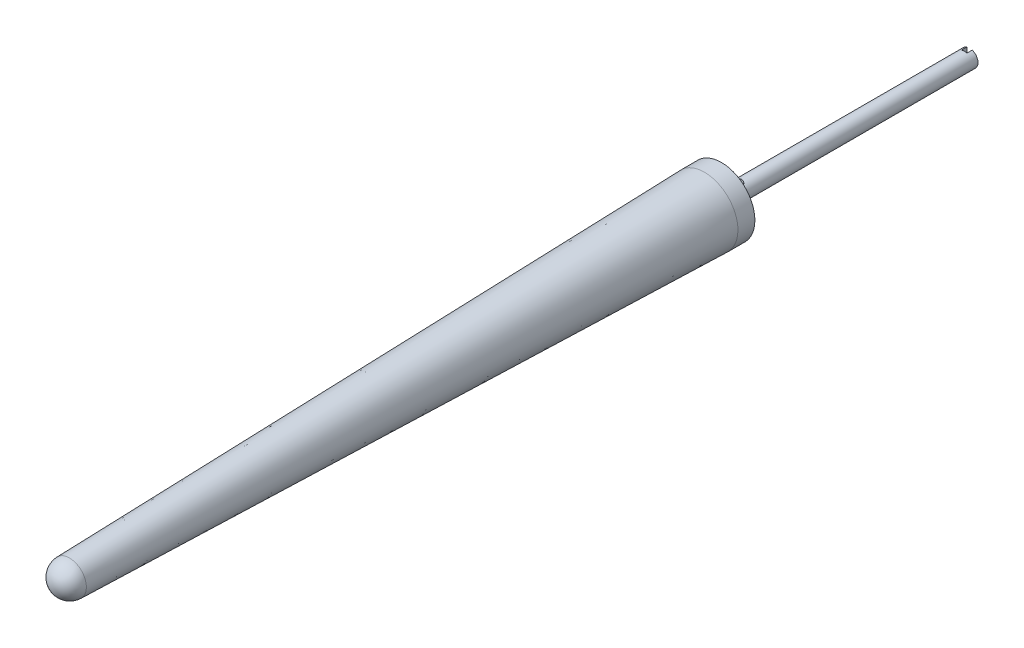
ISO-10303-21;
HEADER;
FILE_DESCRIPTION(('STEP AP214'),'2;1');
FILE_NAME('part.step','',(''),(''),'','','');
FILE_SCHEMA(('AUTOMOTIVE_DESIGN { 1 0 10303 214 1 1 1 1 }'));
ENDSEC;
DATA;
#1=APPLICATION_CONTEXT('core data for automotive mechanical design processes');
#2=APPLICATION_PROTOCOL_DEFINITION('international standard','automotive_design',2000,#1);
#3=PRODUCT_CONTEXT('',#1,'mechanical');
#4=PRODUCT('Part','Part','',(#3));
#5=PRODUCT_RELATED_PRODUCT_CATEGORY('part','',(#4));
#6=PRODUCT_DEFINITION_FORMATION('','',#4);
#7=PRODUCT_DEFINITION_CONTEXT('part definition',#1,'design');
#8=PRODUCT_DEFINITION('design','',#6,#7);
#9=PRODUCT_DEFINITION_SHAPE('','',#8);
#10=(LENGTH_UNIT() NAMED_UNIT(*) SI_UNIT(.MILLI.,.METRE.));
#11=(NAMED_UNIT(*) PLANE_ANGLE_UNIT() SI_UNIT($,.RADIAN.));
#12=(NAMED_UNIT(*) SI_UNIT($,.STERADIAN.) SOLID_ANGLE_UNIT());
#13=UNCERTAINTY_MEASURE_WITH_UNIT(LENGTH_MEASURE(1.E-05),#10,'distance_accuracy_value','');
#14=(GEOMETRIC_REPRESENTATION_CONTEXT(3) GLOBAL_UNCERTAINTY_ASSIGNED_CONTEXT((#13)) GLOBAL_UNIT_ASSIGNED_CONTEXT((#10,
#11,#12)) REPRESENTATION_CONTEXT('',''));
#15=CARTESIAN_POINT('',(0.,0.,0.));
#16=DIRECTION('',(0.,0.,1.));
#17=DIRECTION('',(1.,0.,0.));
#18=AXIS2_PLACEMENT_3D('',#15,#16,#17);
#19=CARTESIAN_POINT('',(0.,0.,0.));
#20=DIRECTION('',(0.,0.,-1.));
#21=DIRECTION('',(0.,1.,0.));
#22=AXIS2_PLACEMENT_3D('',#19,#20,#21);
#23=PLANE('',#22);
#24=CARTESIAN_POINT('',(0.,0.,0.));
#25=DIRECTION('',(0.,0.,-1.));
#26=DIRECTION('',(0.,1.,0.));
#27=AXIS2_PLACEMENT_3D('',#24,#25,#26);
#28=CIRCLE('',#27,2.555);
#29=CARTESIAN_POINT('',(0.81,2.42320552161801,0.));
#30=VERTEX_POINT('',#29);
#31=CARTESIAN_POINT('',(0.81,-2.42320552161801,0.));
#32=VERTEX_POINT('',#31);
#33=EDGE_CURVE('E50',#30,#32,#28,.T.);
#34=ORIENTED_EDGE('',*,*,#33,.T.);
#35=DIRECTION('',(0.,1.,0.));
#36=VECTOR('',#35,1.);
#37=CARTESIAN_POINT('',(0.81,0.,0.));
#38=LINE('',#37,#36);
#39=EDGE_CURVE('E86',#32,#30,#38,.T.);
#40=ORIENTED_EDGE('',*,*,#39,.T.);
#41=EDGE_LOOP('',(#34,#40));
#42=FACE_BOUND('',#41,.T.);
#43=ADVANCED_FACE('F38',(#42),#23,.T.);
#44=CARTESIAN_POINT('',(-0.810000000000001,-2.42320552161801,0.));
#45=VERTEX_POINT('',#44);
#46=CARTESIAN_POINT('',(-0.810000000000001,2.42320552161801,0.));
#47=VERTEX_POINT('',#46);
#48=EDGE_CURVE('E133',#45,#47,#28,.T.);
#49=ORIENTED_EDGE('',*,*,#48,.T.);
#50=DIRECTION('',(0.,-1.,0.));
#51=VECTOR('',#50,1.);
#52=CARTESIAN_POINT('',(-0.810000000000001,0.,0.));
#53=LINE('',#52,#51);
#54=EDGE_CURVE('E100',#47,#45,#53,.T.);
#55=ORIENTED_EDGE('',*,*,#54,.T.);
#56=EDGE_LOOP('',(#49,#55));
#57=FACE_BOUND('',#56,.T.);
#58=ADVANCED_FACE('F163',(#57),#23,.T.);
#59=CARTESIAN_POINT('',(0.,0.,0.));
#60=DIRECTION('',(0.,0.,-1.));
#61=DIRECTION('',(0.,1.,0.));
#62=AXIS2_PLACEMENT_3D('',#59,#60,#61);
#63=CYLINDRICAL_SURFACE('',#62,2.555);
#64=CARTESIAN_POINT('',(0.,2.55499999999999,71.675));
#65=CARTESIAN_POINT('',(0.0770059698897007,2.5549939567661,71.6749931497951));
#66=CARTESIAN_POINT('',(0.154128706922779,2.55148033661649,71.6690289649739));
#67=CARTESIAN_POINT('',(0.306087176172844,2.53775354535387,71.6454611228513));
#68=CARTESIAN_POINT('',(0.380916089762932,2.52752210987463,71.6278257328872));
#69=CARTESIAN_POINT('',(0.525736054215615,2.50140242897395,71.5818913920997));
#70=CARTESIAN_POINT('',(0.59574902732163,2.48554216631569,71.5536451514195));
#71=CARTESIAN_POINT('',(0.729832545082676,2.4495296153609,71.4876061357694));
#72=CARTESIAN_POINT('',(0.793904986450894,2.42937870381841,71.4498164223217));
#73=CARTESIAN_POINT('',(0.919703734141278,2.38473264175775,71.3626164567013));
#74=CARTESIAN_POINT('',(0.980898208715174,2.36002552747576,71.3125494992406));
#75=CARTESIAN_POINT('',(1.09454116088226,2.30951957330275,71.2036802769454));
#76=CARTESIAN_POINT('',(1.14697854468765,2.28371939976013,71.1448671076687));
#77=CARTESIAN_POINT('',(1.24778847161014,2.2303950240156,71.0121125106492));
#78=CARTESIAN_POINT('',(1.29498050412057,2.2030188926985,70.9372072876753));
#79=CARTESIAN_POINT('',(1.37591564682643,2.15340323029841,70.7789236861718));
#80=CARTESIAN_POINT('',(1.40968000703981,2.13115560672199,70.6955589598539));
#81=CARTESIAN_POINT('',(1.45593907800053,2.0997283946479,70.5425108436391));
#82=CARTESIAN_POINT('',(1.47155274903126,2.08871362883254,70.4741481685176));
#83=CARTESIAN_POINT('',(1.49307108752029,2.07338986464256,70.3352052206688));
#84=CARTESIAN_POINT('',(1.49898704190472,2.06907307098169,70.2646276235206));
#85=CARTESIAN_POINT('',(1.50077498550909,2.06777691194061,70.1231585473327));
#86=CARTESIAN_POINT('',(1.49663016612963,2.07080982574998,70.0522667407993));
#87=CARTESIAN_POINT('',(1.47851761161012,2.08377748127177,69.9123818474535));
#88=CARTESIAN_POINT('',(1.4645427675151,2.09371721785169,69.8433901723386));
#89=CARTESIAN_POINT('',(1.42764937567467,2.11904016541578,69.7095998791518));
#90=CARTESIAN_POINT('',(1.40480823633467,2.13437615811386,69.6447704807733));
#91=CARTESIAN_POINT('',(1.35099818509553,2.16883554611701,69.5196786042477));
#92=CARTESIAN_POINT('',(1.32002623331173,2.18796035729841,69.4594178450706));
#93=CARTESIAN_POINT('',(1.24481801410408,2.2317362640171,69.334400181644));
#94=CARTESIAN_POINT('',(1.19922658505693,2.25677570756092,69.2705937582982));
#95=CARTESIAN_POINT('',(1.09878456388406,2.30735014242893,69.1508978101071));
#96=CARTESIAN_POINT('',(1.04392553387584,2.33288556640776,69.095015586075));
#97=CARTESIAN_POINT('',(0.918169125790957,2.38541385955836,68.9855609541257));
#98=CARTESIAN_POINT('',(0.846118945745785,2.41217814329383,68.9331891873124));
#99=CARTESIAN_POINT('',(0.69260259744821,2.46064814442818,68.841478595311));
#100=CARTESIAN_POINT('',(0.611141982952746,2.48235682290701,68.8021321354486));
#101=CARTESIAN_POINT('',(0.446595986595554,2.51697554073947,68.7405155068271));
#102=CARTESIAN_POINT('',(0.363976362745708,2.530373486345,68.7172861726704));
#103=CARTESIAN_POINT('',(0.195115659548756,2.5489489262743,68.6852715199472));
#104=CARTESIAN_POINT('',(0.108878665284251,2.55413545013892,68.6764703353496));
#105=CARTESIAN_POINT('',(-0.052682390869906,2.5555671869151,68.674035889805));
#106=CARTESIAN_POINT('',(-0.127976854594546,2.55288105775809,68.6785898187282));
#107=CARTESIAN_POINT('',(-0.276532702127037,2.54108321566118,68.6988066055047));
#108=CARTESIAN_POINT('',(-0.349794089038197,2.5319715125299,68.7144694464002));
#109=CARTESIAN_POINT('',(-0.491055956611559,2.50837297064611,68.7557783630785));
#110=CARTESIAN_POINT('',(-0.559126323277488,2.49398353018161,68.7812439312919));
#111=CARTESIAN_POINT('',(-0.690041742585759,2.46098157020235,68.8411968768074));
#112=CARTESIAN_POINT('',(-0.752885663175146,2.44236813900597,68.8756862019909));
#113=CARTESIAN_POINT('',(-0.878636575110542,2.40018059328197,68.9567374848173));
#114=CARTESIAN_POINT('',(-0.940866965178772,2.37629160415719,69.0041832514027));
#115=CARTESIAN_POINT('',(-1.05696263058124,2.32698139764641,69.1078093926084));
#116=CARTESIAN_POINT('',(-1.11081801100005,2.30155841634459,69.1639999446137));
#117=CARTESIAN_POINT('',(-1.21536725077065,2.24827745419766,69.2915469283686));
#118=CARTESIAN_POINT('',(-1.26487398247557,2.22050076175489,69.3639172428554));
#119=CARTESIAN_POINT('',(-1.35098717853863,2.16918833625056,69.517317821603));
#120=CARTESIAN_POINT('',(-1.38760908759435,2.14564754238795,69.5983375650599));
#121=CARTESIAN_POINT('',(-1.43996225426285,2.11075887826738,69.7490591550851));
#122=CARTESIAN_POINT('',(-1.4584965205662,2.09787595138669,69.8174290625986));
#123=CARTESIAN_POINT('',(-1.48576410933503,2.07865721899144,69.9569587623675));
#124=CARTESIAN_POINT('',(-1.49450994722198,2.07231305388164,70.0281148713768));
#125=CARTESIAN_POINT('',(-1.50171539468282,2.06709918943243,70.1714400080412));
#126=CARTESIAN_POINT('',(-1.50014507474609,2.0682512382153,70.2436113762406));
#127=CARTESIAN_POINT('',(-1.48674831163694,2.07789973491922,70.3865098565017));
#128=CARTESIAN_POINT('',(-1.47491572815937,2.0864005798965,70.4572360779393));
#129=CARTESIAN_POINT('',(-1.44222233395535,2.10912162607089,70.5929857758003));
#130=CARTESIAN_POINT('',(-1.4216763661425,2.12314125342741,70.6581208345357));
#131=CARTESIAN_POINT('',(-1.3724251905008,2.15530431656303,70.7841229548011));
#132=CARTESIAN_POINT('',(-1.34371690995769,2.17344930482376,70.8449883982501));
#133=CARTESIAN_POINT('',(-1.2738350700616,2.21523552599267,70.970797686459));
#134=CARTESIAN_POINT('',(-1.231419442007,2.23929275533318,71.0349127711018));
#135=CARTESIAN_POINT('',(-1.13754366002254,2.28841238422208,71.1557430448492));
#136=CARTESIAN_POINT('',(-1.08607630686972,2.31347557151368,71.2124522807358));
#137=CARTESIAN_POINT('',(-0.966710576857526,2.36608012336212,71.3252834805806));
#138=CARTESIAN_POINT('',(-0.897511339270102,2.39345237742522,71.3801226738291));
#139=CARTESIAN_POINT('',(-0.749406533989161,2.44387762305054,71.477398316977));
#140=CARTESIAN_POINT('',(-0.670498465984121,2.46692949811429,71.5198315624384));
#141=CARTESIAN_POINT('',(-0.508422824731335,2.50521910420868,71.588820816449));
#142=CARTESIAN_POINT('',(-0.425595134986147,2.52075587379087,71.6159929465936));
#143=CARTESIAN_POINT('',(-0.298202353475473,2.53790263282681,71.6457084580572));
#144=CARTESIAN_POINT('',(-0.255262777641471,2.54259000184083,71.6537703058155));
#145=CARTESIAN_POINT('',(-0.168674216795624,2.54979425707585,71.6661248836621));
#146=CARTESIAN_POINT('',(-0.125025821629426,2.55231286232562,71.6704205989518));
#147=CARTESIAN_POINT('',(-0.0542074134874949,2.55456949710886,71.674266422091));
#148=CARTESIAN_POINT('',(-0.0271109432864072,2.5550021275983,71.6750024117028));
#149=CARTESIAN_POINT('',(0.,2.55499999999999,71.675));
#150=B_SPLINE_CURVE_WITH_KNOTS('',3,(#64,#65,#66,#67,#68,#69,#70,#71,#72,#73,#74,#75,#76,#77,
#78,#79,#80,#81,#82,#83,#84,#85,#86,#87,#88,#89,#90,#91,#92,#93,#94,#95,#96,#97,#98,#99,#100,
#101,#102,#103,#104,#105,#106,#107,#108,#109,#110,#111,#112,#113,#114,#115,#116,#117,#118,#119,
#120,#121,#122,#123,#124,#125,#126,#127,#128,#129,#130,#131,#132,#133,#134,#135,#136,#137,#138,
#139,#140,#141,#142,#143,#144,#145,#146,#147,#148,#149),.UNSPECIFIED.,.T.,.F.,(4,2,2,2,2,2,2,2,
2,2,2,2,2,2,2,2,2,2,2,2,2,2,2,2,2,2,2,2,2,2,2,2,2,2,2,2,2,2,2,2,2,2,4),(0.,0.23092052914322,
0.462471498251258,0.692887113980689,0.923228906641973,1.17075877573799,1.41859988386794,
1.69524231700337,1.97144518951478,2.18348333063536,2.39527451027492,2.60741977427472,
2.81971861710888,3.03020419735185,3.24076858465199,3.48677499583314,3.7330066079395,
4.01059859695246,4.28802758846418,4.54706392358518,4.80581521576945,5.03113525099953,
5.25645494227992,5.47781005688637,5.69921299301163,5.94370032182232,6.18847434841535,
6.46310838271006,6.7374120897928,6.95250620310438,7.16732498316266,7.38276727584325,
7.59833856489739,7.80670757373467,8.01515512747786,8.2558925955435,8.49682240547028,
8.77276199330388,9.04877279308351,9.31264652838948,9.44428859050131,9.57582621277052,
9.65712475856166),.UNSPECIFIED.);
#151=CARTESIAN_POINT('',(0.,2.55499999999999,71.675));
#152=VERTEX_POINT('',#151);
#153=EDGE_CURVE('E11',#152,#152,#150,.T.);
#154=ORIENTED_EDGE('',*,*,#153,.F.);
#155=EDGE_LOOP('',(#154));
#156=FACE_BOUND('',#155,.T.);
#157=CARTESIAN_POINT('',(0.,0.,74.8));
#158=DIRECTION('',(0.,0.,-1.));
#159=DIRECTION('',(0.,1.,0.));
#160=AXIS2_PLACEMENT_3D('',#157,#158,#159);
#161=CIRCLE('',#160,2.555);
#162=CARTESIAN_POINT('',(0.,2.55499999999999,74.8));
#163=VERTEX_POINT('',#162);
#164=EDGE_CURVE('E129',#163,#163,#161,.T.);
#165=ORIENTED_EDGE('',*,*,#164,.T.);
#166=EDGE_LOOP('',(#165));
#167=FACE_BOUND('',#166,.T.);
#168=CARTESIAN_POINT('',(0.,0.,1.62));
#169=DIRECTION('',(0.,0.,-1.));
#170=DIRECTION('',(0.,1.,0.));
#171=AXIS2_PLACEMENT_3D('',#168,#169,#170);
#172=CIRCLE('',#171,2.555);
#173=CARTESIAN_POINT('',(0.81,-2.42320552161801,1.62));
#174=VERTEX_POINT('',#173);
#175=CARTESIAN_POINT('',(-0.810000000000001,-2.42320552161801,1.62));
#176=VERTEX_POINT('',#175);
#177=EDGE_CURVE('E96',#174,#176,#172,.T.);
#178=ORIENTED_EDGE('',*,*,#177,.F.);
#179=DIRECTION('',(0.,0.,-1.));
#180=VECTOR('',#179,1.);
#181=CARTESIAN_POINT('',(0.81,-2.42320552161801,1.62));
#182=LINE('',#181,#180);
#183=EDGE_CURVE('E84',#174,#32,#182,.T.);
#184=ORIENTED_EDGE('',*,*,#183,.T.);
#185=ORIENTED_EDGE('',*,*,#33,.F.);
#186=DIRECTION('',(0.,0.,-1.));
#187=VECTOR('',#186,1.);
#188=CARTESIAN_POINT('',(0.81,2.42320552161801,1.62));
#189=LINE('',#188,#187);
#190=CARTESIAN_POINT('',(0.81,2.42320552161801,1.62));
#191=VERTEX_POINT('',#190);
#192=EDGE_CURVE('E81',#191,#30,#189,.T.);
#193=ORIENTED_EDGE('',*,*,#192,.F.);
#194=CARTESIAN_POINT('',(-0.810000000000001,2.42320552161801,1.62));
#195=VERTEX_POINT('',#194);
#196=EDGE_CURVE('E93',#195,#191,#172,.T.);
#197=ORIENTED_EDGE('',*,*,#196,.F.);
#198=DIRECTION('',(0.,0.,-1.));
#199=VECTOR('',#198,1.);
#200=CARTESIAN_POINT('',(-0.810000000000001,2.42320552161801,1.62));
#201=LINE('',#200,#199);
#202=EDGE_CURVE('E111',#195,#47,#201,.T.);
#203=ORIENTED_EDGE('',*,*,#202,.T.);
#204=ORIENTED_EDGE('',*,*,#48,.F.);
#205=DIRECTION('',(0.,0.,-1.));
#206=VECTOR('',#205,1.);
#207=CARTESIAN_POINT('',(-0.810000000000001,-2.42320552161801,1.62));
#208=LINE('',#207,#206);
#209=EDGE_CURVE('E92',#176,#45,#208,.T.);
#210=ORIENTED_EDGE('',*,*,#209,.F.);
#211=EDGE_LOOP('',(#178,#184,#185,#193,#197,#203,#204,#210));
#212=FACE_BOUND('',#211,.T.);
#213=ADVANCED_FACE('F102',(#156,#167,#212),#63,.T.);
#214=CARTESIAN_POINT('',(0.,2.55499999999999,74.8));
#215=DIRECTION('',(0.,0.,-1.));
#216=DIRECTION('',(0.,1.,0.));
#217=AXIS2_PLACEMENT_3D('',#214,#215,#216);
#218=PLANE('',#217);
#219=CARTESIAN_POINT('',(0.,0.,74.8));
#220=DIRECTION('',(0.,0.,-1.));
#221=DIRECTION('',(0.,1.,0.));
#222=AXIS2_PLACEMENT_3D('',#219,#220,#221);
#223=CIRCLE('',#222,10.07);
#224=CARTESIAN_POINT('',(0.,10.07,74.8));
#225=VERTEX_POINT('',#224);
#226=EDGE_CURVE('E125',#225,#225,#223,.T.);
#227=ORIENTED_EDGE('',*,*,#226,.T.);
#228=EDGE_LOOP('',(#227));
#229=FACE_BOUND('',#228,.T.);
#230=ORIENTED_EDGE('',*,*,#164,.F.);
#231=EDGE_LOOP('',(#230));
#232=FACE_BOUND('',#231,.T.);
#233=ADVANCED_FACE('F172',(#229,#232),#218,.T.);
#234=CARTESIAN_POINT('',(0.,0.,0.));
#235=DIRECTION('',(0.,0.,-1.));
#236=DIRECTION('',(0.,1.,0.));
#237=AXIS2_PLACEMENT_3D('',#234,#235,#236);
#238=CYLINDRICAL_SURFACE('',#237,10.07);
#239=CARTESIAN_POINT('',(0.,0.,79.91));
#240=DIRECTION('',(0.,0.,-1.));
#241=DIRECTION('',(0.,1.,0.));
#242=AXIS2_PLACEMENT_3D('',#239,#240,#241);
#243=CIRCLE('',#242,10.07);
#244=CARTESIAN_POINT('',(0.,10.07,79.91));
#245=VERTEX_POINT('',#244);
#246=EDGE_CURVE('E121',#245,#245,#243,.T.);
#247=ORIENTED_EDGE('',*,*,#246,.T.);
#248=EDGE_LOOP('',(#247));
#249=FACE_BOUND('',#248,.T.);
#250=ORIENTED_EDGE('',*,*,#226,.F.);
#251=EDGE_LOOP('',(#250));
#252=FACE_BOUND('',#251,.T.);
#253=ADVANCED_FACE('F189',(#249,#252),#238,.T.);
#254=CARTESIAN_POINT('',(0.,0.,79.91));
#255=DIRECTION('',(0.,0.,-1.));
#256=DIRECTION('',(0.,1.,0.));
#257=AXIS2_PLACEMENT_3D('',#254,#255,#256);
#258=CONICAL_SURFACE('',#257,10.07,0.0259022696606715);
#259=CARTESIAN_POINT('',(0.,0.,271.422345797733));
#260=DIRECTION('',(0.,0.,-1.));
#261=DIRECTION('',(0.,1.,0.));
#262=AXIS2_PLACEMENT_3D('',#259,#260,#261);
#263=CIRCLE('',#262,5.1082858758905);
#264=CARTESIAN_POINT('',(0.,5.10828587589046,271.422345797733));
#265=VERTEX_POINT('',#264);
#266=EDGE_CURVE('E117',#265,#265,#263,.T.);
#267=ORIENTED_EDGE('',*,*,#266,.T.);
#268=EDGE_LOOP('',(#267));
#269=FACE_BOUND('',#268,.T.);
#270=ORIENTED_EDGE('',*,*,#246,.F.);
#271=EDGE_LOOP('',(#270));
#272=FACE_BOUND('',#271,.T.);
#273=ADVANCED_FACE('F185',(#269,#272),#258,.T.);
#274=CARTESIAN_POINT('',(0.,0.,271.29));
#275=DIRECTION('',(0.,0.,-1.));
#276=DIRECTION('',(0.,1.,0.));
#277=AXIS2_PLACEMENT_3D('',#274,#275,#276);
#278=SPHERICAL_SURFACE('',#277,5.11);
#279=ORIENTED_EDGE('',*,*,#266,.F.);
#280=EDGE_LOOP('',(#279));
#281=FACE_BOUND('',#280,.T.);
#282=ADVANCED_FACE('F180',(#281),#278,.T.);
#283=CARTESIAN_POINT('',(0.81,0.,1.62));
#284=DIRECTION('',(-1.,0.,0.));
#285=DIRECTION('',(0.,0.,1.));
#286=AXIS2_PLACEMENT_3D('',#283,#284,#285);
#287=PLANE('',#286);
#288=ORIENTED_EDGE('',*,*,#39,.F.);
#289=ORIENTED_EDGE('',*,*,#183,.F.);
#290=DIRECTION('',(0.,1.,0.));
#291=VECTOR('',#290,1.);
#292=CARTESIAN_POINT('',(0.81,0.,1.62));
#293=LINE('',#292,#291);
#294=EDGE_CURVE('E66',#174,#191,#293,.T.);
#295=ORIENTED_EDGE('',*,*,#294,.T.);
#296=ORIENTED_EDGE('',*,*,#192,.T.);
#297=EDGE_LOOP('',(#288,#289,#295,#296));
#298=FACE_BOUND('',#297,.T.);
#299=ADVANCED_FACE('F85',(#298),#287,.T.);
#300=CARTESIAN_POINT('',(-0.810000000000001,0.,1.62));
#301=DIRECTION('',(1.,0.,0.));
#302=DIRECTION('',(0.,0.,-1.));
#303=AXIS2_PLACEMENT_3D('',#300,#301,#302);
#304=PLANE('',#303);
#305=ORIENTED_EDGE('',*,*,#54,.F.);
#306=ORIENTED_EDGE('',*,*,#202,.F.);
#307=DIRECTION('',(0.,-1.,0.));
#308=VECTOR('',#307,1.);
#309=CARTESIAN_POINT('',(-0.810000000000001,0.,1.62));
#310=LINE('',#309,#308);
#311=EDGE_CURVE('E57',#195,#176,#310,.T.);
#312=ORIENTED_EDGE('',*,*,#311,.T.);
#313=ORIENTED_EDGE('',*,*,#209,.T.);
#314=EDGE_LOOP('',(#305,#306,#312,#313));
#315=FACE_BOUND('',#314,.T.);
#316=ADVANCED_FACE('F159',(#315),#304,.T.);
#317=CARTESIAN_POINT('',(0.,0.,1.62));
#318=DIRECTION('',(0.,0.,-1.));
#319=DIRECTION('',(0.,1.,0.));
#320=AXIS2_PLACEMENT_3D('',#317,#318,#319);
#321=PLANE('',#320);
#322=ORIENTED_EDGE('',*,*,#294,.F.);
#323=ORIENTED_EDGE('',*,*,#177,.T.);
#324=ORIENTED_EDGE('',*,*,#311,.F.);
#325=ORIENTED_EDGE('',*,*,#196,.T.);
#326=EDGE_LOOP('',(#322,#323,#324,#325));
#327=FACE_BOUND('',#326,.T.);
#328=ADVANCED_FACE('F95',(#327),#321,.T.);
#329=CARTESIAN_POINT('',(0.,0.554999999999991,70.175));
#330=DIRECTION('',(0.,1.,0.));
#331=DIRECTION('',(0.,0.,1.));
#332=AXIS2_PLACEMENT_3D('',#329,#330,#331);
#333=CYLINDRICAL_SURFACE('',#332,1.5);
#334=ORIENTED_EDGE('',*,*,#153,.T.);
#335=EDGE_LOOP('',(#334));
#336=FACE_BOUND('',#335,.T.);
#337=CARTESIAN_POINT('',(0.,0.554999999999991,70.175));
#338=DIRECTION('',(0.,1.,0.));
#339=DIRECTION('',(0.,0.,1.));
#340=AXIS2_PLACEMENT_3D('',#337,#338,#339);
#341=CIRCLE('',#340,1.5);
#342=CARTESIAN_POINT('',(0.,0.554999999999991,71.675));
#343=VERTEX_POINT('',#342);
#344=EDGE_CURVE('E143',#343,#343,#341,.T.);
#345=ORIENTED_EDGE('',*,*,#344,.F.);
#346=EDGE_LOOP('',(#345));
#347=FACE_BOUND('',#346,.T.);
#348=ADVANCED_FACE('F151',(#336,#347),#333,.F.);
#349=CARTESIAN_POINT('',(0.,0.554999999999999,0.));
#350=DIRECTION('',(0.,1.,0.));
#351=DIRECTION('',(0.,0.,1.));
#352=AXIS2_PLACEMENT_3D('',#349,#350,#351);
#353=PLANE('',#352);
#354=ORIENTED_EDGE('',*,*,#344,.T.);
#355=EDGE_LOOP('',(#354));
#356=FACE_BOUND('',#355,.T.);
#357=ADVANCED_FACE('F149',(#356),#353,.T.);
#358=CLOSED_SHELL('',(#43,#58,#213,#233,#253,#273,#282,#299,#316,#328,#348,#357));
#359=MANIFOLD_SOLID_BREP('B2',#358);
#360=ADVANCED_BREP_SHAPE_REPRESENTATION('',(#18,#359),#14);
#361=SHAPE_DEFINITION_REPRESENTATION(#9,#360);
ENDSEC;
END-ISO-10303-21;
